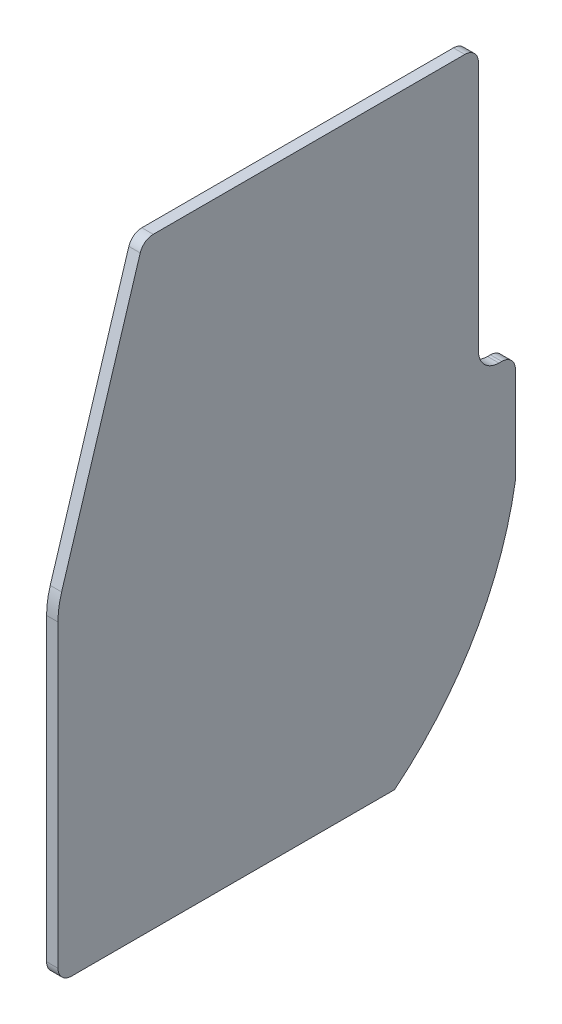
ISO-10303-21;
HEADER;
FILE_DESCRIPTION(('STEP AP214'),'2;1');
FILE_NAME('part.step','',(''),(''),'','','');
FILE_SCHEMA(('AUTOMOTIVE_DESIGN { 1 0 10303 214 1 1 1 1 }'));
ENDSEC;
DATA;
#1=APPLICATION_CONTEXT('core data for automotive mechanical design processes');
#2=APPLICATION_PROTOCOL_DEFINITION('international standard','automotive_design',2000,#1);
#3=PRODUCT_CONTEXT('',#1,'mechanical');
#4=PRODUCT('Part','Part','',(#3));
#5=PRODUCT_RELATED_PRODUCT_CATEGORY('part','',(#4));
#6=PRODUCT_DEFINITION_FORMATION('','',#4);
#7=PRODUCT_DEFINITION_CONTEXT('part definition',#1,'design');
#8=PRODUCT_DEFINITION('design','',#6,#7);
#9=PRODUCT_DEFINITION_SHAPE('','',#8);
#10=(LENGTH_UNIT() NAMED_UNIT(*) SI_UNIT(.MILLI.,.METRE.));
#11=(NAMED_UNIT(*) PLANE_ANGLE_UNIT() SI_UNIT($,.RADIAN.));
#12=(NAMED_UNIT(*) SI_UNIT($,.STERADIAN.) SOLID_ANGLE_UNIT());
#13=UNCERTAINTY_MEASURE_WITH_UNIT(LENGTH_MEASURE(1.E-05),#10,'distance_accuracy_value','');
#14=(GEOMETRIC_REPRESENTATION_CONTEXT(3) GLOBAL_UNCERTAINTY_ASSIGNED_CONTEXT((#13)) GLOBAL_UNIT_ASSIGNED_CONTEXT((#10,
#11,#12)) REPRESENTATION_CONTEXT('',''));
#15=CARTESIAN_POINT('',(0.,0.,0.));
#16=DIRECTION('',(0.,0.,1.));
#17=DIRECTION('',(1.,0.,0.));
#18=AXIS2_PLACEMENT_3D('',#15,#16,#17);
#19=CARTESIAN_POINT('',(20.,31.4994505346116,291.80217267077));
#20=DIRECTION('',(-1.,0.,0.));
#21=DIRECTION('',(0.,0.,1.));
#22=AXIS2_PLACEMENT_3D('',#19,#20,#21);
#23=CYLINDRICAL_SURFACE('',#22,144.);
#24=CARTESIAN_POINT('',(0.,31.4994505346116,291.80217267077));
#25=DIRECTION('',(1.,0.,0.));
#26=DIRECTION('',(0.,0.,-1.));
#27=AXIS2_PLACEMENT_3D('',#24,#25,#26);
#28=CIRCLE('',#27,144.);
#29=CARTESIAN_POINT('',(0.,74.0235535369056,429.380152972308));
#30=VERTEX_POINT('',#29);
#31=CARTESIAN_POINT('',(0.,31.499450534611,435.80217267077));
#32=VERTEX_POINT('',#31);
#33=EDGE_CURVE('E183',#30,#32,#28,.T.);
#34=ORIENTED_EDGE('',*,*,#33,.T.);
#35=DIRECTION('',(-1.,0.,0.));
#36=VECTOR('',#35,1.);
#37=CARTESIAN_POINT('',(20.,31.499450534611,435.80217267077));
#38=LINE('',#37,#36);
#39=CARTESIAN_POINT('',(20.,31.499450534611,435.80217267077));
#40=VERTEX_POINT('',#39);
#41=EDGE_CURVE('E242',#40,#32,#38,.T.);
#42=ORIENTED_EDGE('',*,*,#41,.F.);
#43=CARTESIAN_POINT('',(20.,31.4994505346116,291.80217267077));
#44=DIRECTION('',(1.,0.,0.));
#45=DIRECTION('',(0.,0.,-1.));
#46=AXIS2_PLACEMENT_3D('',#43,#44,#45);
#47=CIRCLE('',#46,144.);
#48=CARTESIAN_POINT('',(20.,74.0235535369056,429.380152972308));
#49=VERTEX_POINT('',#48);
#50=EDGE_CURVE('E211',#49,#40,#47,.T.);
#51=ORIENTED_EDGE('',*,*,#50,.F.);
#52=DIRECTION('',(-1.,0.,0.));
#53=VECTOR('',#52,1.);
#54=CARTESIAN_POINT('',(20.,74.0235535369056,429.380152972308));
#55=LINE('',#54,#53);
#56=EDGE_CURVE('E179',#49,#30,#55,.T.);
#57=ORIENTED_EDGE('',*,*,#56,.T.);
#58=EDGE_LOOP('',(#34,#42,#51,#57));
#59=FACE_BOUND('',#58,.T.);
#60=ADVANCED_FACE('F39',(#59),#23,.T.);
#61=CARTESIAN_POINT('',(20.,31.499450534611,435.80217267077));
#62=DIRECTION('',(0.,0.,-1.));
#63=DIRECTION('',(-1.,0.,0.));
#64=AXIS2_PLACEMENT_3D('',#61,#62,#63);
#65=PLANE('',#64);
#66=DIRECTION('',(0.,-1.,0.));
#67=VECTOR('',#66,1.);
#68=CARTESIAN_POINT('',(0.,31.499450534611,435.80217267077));
#69=LINE('',#68,#67);
#70=CARTESIAN_POINT('',(0.,-495.847444831591,435.80217267077));
#71=VERTEX_POINT('',#70);
#72=EDGE_CURVE('E186',#32,#71,#69,.T.);
#73=ORIENTED_EDGE('',*,*,#72,.T.);
#74=DIRECTION('',(-1.,0.,0.));
#75=VECTOR('',#74,1.);
#76=CARTESIAN_POINT('',(20.,-495.847444831591,435.80217267077));
#77=LINE('',#76,#75);
#78=CARTESIAN_POINT('',(20.,-495.847444831591,435.80217267077));
#79=VERTEX_POINT('',#78);
#80=EDGE_CURVE('E239',#79,#71,#77,.T.);
#81=ORIENTED_EDGE('',*,*,#80,.F.);
#82=DIRECTION('',(0.,-1.,0.));
#83=VECTOR('',#82,1.);
#84=CARTESIAN_POINT('',(20.,31.499450534611,435.80217267077));
#85=LINE('',#84,#83);
#86=EDGE_CURVE('E122',#40,#79,#85,.T.);
#87=ORIENTED_EDGE('',*,*,#86,.F.);
#88=ORIENTED_EDGE('',*,*,#41,.T.);
#89=EDGE_LOOP('',(#73,#81,#87,#88));
#90=FACE_BOUND('',#89,.T.);
#91=ADVANCED_FACE('F372',(#90),#65,.F.);
#92=CARTESIAN_POINT('',(20.,-495.847444831591,411.80217267077));
#93=DIRECTION('',(-1.,0.,0.));
#94=DIRECTION('',(0.,0.,1.));
#95=AXIS2_PLACEMENT_3D('',#92,#93,#94);
#96=CYLINDRICAL_SURFACE('',#95,24.);
#97=CARTESIAN_POINT('',(0.,-495.847444831591,411.80217267077));
#98=DIRECTION('',(1.,0.,0.));
#99=DIRECTION('',(0.,0.,-1.));
#100=AXIS2_PLACEMENT_3D('',#97,#98,#99);
#101=CIRCLE('',#100,24.);
#102=CARTESIAN_POINT('',(0.,-519.847444831591,411.80217267077));
#103=VERTEX_POINT('',#102);
#104=EDGE_CURVE('E189',#71,#103,#101,.T.);
#105=ORIENTED_EDGE('',*,*,#104,.T.);
#106=DIRECTION('',(-1.,0.,0.));
#107=VECTOR('',#106,1.);
#108=CARTESIAN_POINT('',(20.,-519.847444831591,411.80217267077));
#109=LINE('',#108,#107);
#110=CARTESIAN_POINT('',(20.,-519.847444831591,411.80217267077));
#111=VERTEX_POINT('',#110);
#112=EDGE_CURVE('E236',#111,#103,#109,.T.);
#113=ORIENTED_EDGE('',*,*,#112,.F.);
#114=CARTESIAN_POINT('',(20.,-495.847444831591,411.80217267077));
#115=DIRECTION('',(1.,0.,0.));
#116=DIRECTION('',(0.,0.,-1.));
#117=AXIS2_PLACEMENT_3D('',#114,#115,#116);
#118=CIRCLE('',#117,24.);
#119=EDGE_CURVE('E340',#79,#111,#118,.T.);
#120=ORIENTED_EDGE('',*,*,#119,.F.);
#121=ORIENTED_EDGE('',*,*,#80,.T.);
#122=EDGE_LOOP('',(#105,#113,#120,#121));
#123=FACE_BOUND('',#122,.T.);
#124=ADVANCED_FACE('F375',(#123),#96,.T.);
#125=CARTESIAN_POINT('',(20.,-519.847444831591,411.80217267077));
#126=DIRECTION('',(0.,1.,0.));
#127=DIRECTION('',(0.,0.,1.));
#128=AXIS2_PLACEMENT_3D('',#125,#126,#127);
#129=PLANE('',#128);
#130=DIRECTION('',(0.,0.,-1.));
#131=VECTOR('',#130,1.);
#132=CARTESIAN_POINT('',(0.,-519.847444831591,411.80217267077));
#133=LINE('',#132,#131);
#134=CARTESIAN_POINT('',(0.,-519.847444831591,-156.082330180603));
#135=VERTEX_POINT('',#134);
#136=EDGE_CURVE('E191',#103,#135,#133,.T.);
#137=ORIENTED_EDGE('',*,*,#136,.T.);
#138=DIRECTION('',(-1.,0.,0.));
#139=VECTOR('',#138,1.);
#140=CARTESIAN_POINT('',(20.,-519.847444831591,-156.082330180603));
#141=LINE('',#140,#139);
#142=CARTESIAN_POINT('',(20.,-519.847444831591,-156.082330180603));
#143=VERTEX_POINT('',#142);
#144=EDGE_CURVE('E233',#143,#135,#141,.T.);
#145=ORIENTED_EDGE('',*,*,#144,.F.);
#146=DIRECTION('',(0.,0.,-1.));
#147=VECTOR('',#146,1.);
#148=CARTESIAN_POINT('',(20.,-519.847444831591,411.80217267077));
#149=LINE('',#148,#147);
#150=EDGE_CURVE('E342',#111,#143,#149,.T.);
#151=ORIENTED_EDGE('',*,*,#150,.F.);
#152=ORIENTED_EDGE('',*,*,#112,.T.);
#153=EDGE_LOOP('',(#137,#145,#151,#152));
#154=FACE_BOUND('',#153,.T.);
#155=ADVANCED_FACE('F380',(#154),#129,.F.);
#156=CARTESIAN_POINT('',(20.,-57.8662366714706,217.293302804351));
#157=DIRECTION('',(-1.,0.,0.));
#158=DIRECTION('',(0.,0.,1.));
#159=AXIS2_PLACEMENT_3D('',#156,#157,#158);
#160=CYLINDRICAL_SURFACE('',#159,594.);
#161=CARTESIAN_POINT('',(0.,-57.8662366714706,217.293302804351));
#162=DIRECTION('',(1.,0.,0.));
#163=DIRECTION('',(0.,0.,-1.));
#164=AXIS2_PLACEMENT_3D('',#161,#162,#163);
#165=CIRCLE('',#164,594.);
#166=CARTESIAN_POINT('',(0.,-155.35298069123,-368.652372783775));
#167=VERTEX_POINT('',#166);
#168=EDGE_CURVE('E193',#135,#167,#165,.T.);
#169=ORIENTED_EDGE('',*,*,#168,.T.);
#170=DIRECTION('',(-1.,0.,0.));
#171=VECTOR('',#170,1.);
#172=CARTESIAN_POINT('',(20.,-155.35298069123,-368.652372783775));
#173=LINE('',#172,#171);
#174=CARTESIAN_POINT('',(20.,-155.35298069123,-368.652372783775));
#175=VERTEX_POINT('',#174);
#176=EDGE_CURVE('E230',#175,#167,#173,.T.);
#177=ORIENTED_EDGE('',*,*,#176,.F.);
#178=CARTESIAN_POINT('',(20.,-57.8662366714706,217.293302804351));
#179=DIRECTION('',(1.,0.,0.));
#180=DIRECTION('',(0.,0.,-1.));
#181=AXIS2_PLACEMENT_3D('',#178,#179,#180);
#182=CIRCLE('',#181,594.);
#183=EDGE_CURVE('E344',#143,#175,#182,.T.);
#184=ORIENTED_EDGE('',*,*,#183,.F.);
#185=ORIENTED_EDGE('',*,*,#144,.T.);
#186=EDGE_LOOP('',(#169,#177,#184,#185));
#187=FACE_BOUND('',#186,.T.);
#188=ADVANCED_FACE('F386',(#187),#160,.T.);
#189=CARTESIAN_POINT('',(20.,-155.35298069123,-368.652372783775));
#190=DIRECTION('',(0.,0.,1.));
#191=DIRECTION('',(1.,0.,0.));
#192=AXIS2_PLACEMENT_3D('',#189,#190,#191);
#193=PLANE('',#192);
#194=DIRECTION('',(0.,1.,0.));
#195=VECTOR('',#194,1.);
#196=CARTESIAN_POINT('',(0.,-155.35298069123,-368.652372783775));
#197=LINE('',#196,#195);
#198=CARTESIAN_POINT('',(0.,14.1525551684087,-368.652372783775));
#199=VERTEX_POINT('',#198);
#200=EDGE_CURVE('E195',#167,#199,#197,.T.);
#201=ORIENTED_EDGE('',*,*,#200,.T.);
#202=DIRECTION('',(-1.,0.,0.));
#203=VECTOR('',#202,1.);
#204=CARTESIAN_POINT('',(20.,14.1525551684087,-368.652372783775));
#205=LINE('',#204,#203);
#206=CARTESIAN_POINT('',(20.,14.1525551684087,-368.652372783775));
#207=VERTEX_POINT('',#206);
#208=EDGE_CURVE('E227',#207,#199,#205,.T.);
#209=ORIENTED_EDGE('',*,*,#208,.F.);
#210=DIRECTION('',(0.,1.,0.));
#211=VECTOR('',#210,1.);
#212=CARTESIAN_POINT('',(20.,-155.35298069123,-368.652372783775));
#213=LINE('',#212,#211);
#214=EDGE_CURVE('E346',#175,#207,#213,.T.);
#215=ORIENTED_EDGE('',*,*,#214,.F.);
#216=ORIENTED_EDGE('',*,*,#176,.T.);
#217=EDGE_LOOP('',(#201,#209,#215,#216));
#218=FACE_BOUND('',#217,.T.);
#219=ADVANCED_FACE('F390',(#218),#193,.F.);
#220=CARTESIAN_POINT('',(20.,14.152555168409,-344.652372783775));
#221=DIRECTION('',(-1.,0.,0.));
#222=DIRECTION('',(0.,0.,1.));
#223=AXIS2_PLACEMENT_3D('',#220,#221,#222);
#224=CYLINDRICAL_SURFACE('',#223,24.);
#225=CARTESIAN_POINT('',(0.,14.152555168409,-344.652372783775));
#226=DIRECTION('',(1.,0.,0.));
#227=DIRECTION('',(0.,0.,-1.));
#228=AXIS2_PLACEMENT_3D('',#225,#226,#227);
#229=CIRCLE('',#228,24.);
#230=CARTESIAN_POINT('',(0.,38.1525551684089,-344.652372783775));
#231=VERTEX_POINT('',#230);
#232=EDGE_CURVE('E197',#199,#231,#229,.T.);
#233=ORIENTED_EDGE('',*,*,#232,.T.);
#234=DIRECTION('',(-1.,0.,0.));
#235=VECTOR('',#234,1.);
#236=CARTESIAN_POINT('',(20.,38.1525551684089,-344.652372783775));
#237=LINE('',#236,#235);
#238=CARTESIAN_POINT('',(20.,38.1525551684089,-344.652372783775));
#239=VERTEX_POINT('',#238);
#240=EDGE_CURVE('E224',#239,#231,#237,.T.);
#241=ORIENTED_EDGE('',*,*,#240,.F.);
#242=CARTESIAN_POINT('',(20.,14.152555168409,-344.652372783775));
#243=DIRECTION('',(1.,0.,0.));
#244=DIRECTION('',(0.,0.,-1.));
#245=AXIS2_PLACEMENT_3D('',#242,#243,#244);
#246=CIRCLE('',#245,24.);
#247=EDGE_CURVE('E348',#207,#239,#246,.T.);
#248=ORIENTED_EDGE('',*,*,#247,.F.);
#249=ORIENTED_EDGE('',*,*,#208,.T.);
#250=EDGE_LOOP('',(#233,#241,#248,#249));
#251=FACE_BOUND('',#250,.T.);
#252=ADVANCED_FACE('F395',(#251),#224,.T.);
#253=CARTESIAN_POINT('',(20.,38.1525551684089,-344.652372783775));
#254=DIRECTION('',(0.,-1.,0.));
#255=DIRECTION('',(0.,0.,-1.));
#256=AXIS2_PLACEMENT_3D('',#253,#254,#255);
#257=PLANE('',#256);
#258=DIRECTION('',(0.,0.,1.));
#259=VECTOR('',#258,1.);
#260=CARTESIAN_POINT('',(0.,38.1525551684089,-344.652372783775));
#261=LINE('',#260,#259);
#262=CARTESIAN_POINT('',(0.,38.1525551684091,-339.652372783775));
#263=VERTEX_POINT('',#262);
#264=EDGE_CURVE('E199',#231,#263,#261,.T.);
#265=ORIENTED_EDGE('',*,*,#264,.T.);
#266=DIRECTION('',(-1.,0.,0.));
#267=VECTOR('',#266,1.);
#268=CARTESIAN_POINT('',(20.,38.1525551684091,-339.652372783775));
#269=LINE('',#268,#267);
#270=CARTESIAN_POINT('',(20.,38.1525551684091,-339.652372783775));
#271=VERTEX_POINT('',#270);
#272=EDGE_CURVE('E221',#271,#263,#269,.T.);
#273=ORIENTED_EDGE('',*,*,#272,.F.);
#274=DIRECTION('',(0.,0.,1.));
#275=VECTOR('',#274,1.);
#276=CARTESIAN_POINT('',(20.,38.1525551684089,-344.652372783775));
#277=LINE('',#276,#275);
#278=EDGE_CURVE('E350',#239,#271,#277,.T.);
#279=ORIENTED_EDGE('',*,*,#278,.F.);
#280=ORIENTED_EDGE('',*,*,#240,.T.);
#281=EDGE_LOOP('',(#265,#273,#279,#280));
#282=FACE_BOUND('',#281,.T.);
#283=ADVANCED_FACE('F399',(#282),#257,.F.);
#284=CARTESIAN_POINT('',(20.,74.152555168409,-339.652372783775));
#285=DIRECTION('',(-1.,0.,0.));
#286=DIRECTION('',(0.,0.,1.));
#287=AXIS2_PLACEMENT_3D('',#284,#285,#286);
#288=CYLINDRICAL_SURFACE('',#287,36.);
#289=CARTESIAN_POINT('',(0.,74.152555168409,-339.652372783775));
#290=DIRECTION('',(-1.,0.,0.));
#291=DIRECTION('',(0.,0.,-1.));
#292=AXIS2_PLACEMENT_3D('',#289,#290,#291);
#293=CIRCLE('',#292,36.);
#294=CARTESIAN_POINT('',(0.,74.1525551684092,-303.652372783775));
#295=VERTEX_POINT('',#294);
#296=EDGE_CURVE('E201',#263,#295,#293,.T.);
#297=ORIENTED_EDGE('',*,*,#296,.T.);
#298=DIRECTION('',(-1.,0.,0.));
#299=VECTOR('',#298,1.);
#300=CARTESIAN_POINT('',(20.,74.1525551684092,-303.652372783775));
#301=LINE('',#300,#299);
#302=CARTESIAN_POINT('',(20.,74.1525551684092,-303.652372783775));
#303=VERTEX_POINT('',#302);
#304=EDGE_CURVE('E218',#303,#295,#301,.T.);
#305=ORIENTED_EDGE('',*,*,#304,.F.);
#306=CARTESIAN_POINT('',(20.,74.152555168409,-339.652372783775));
#307=DIRECTION('',(-1.,0.,0.));
#308=DIRECTION('',(0.,0.,-1.));
#309=AXIS2_PLACEMENT_3D('',#306,#307,#308);
#310=CIRCLE('',#309,36.);
#311=EDGE_CURVE('E352',#271,#303,#310,.T.);
#312=ORIENTED_EDGE('',*,*,#311,.F.);
#313=ORIENTED_EDGE('',*,*,#272,.T.);
#314=EDGE_LOOP('',(#297,#305,#312,#313));
#315=FACE_BOUND('',#314,.T.);
#316=ADVANCED_FACE('F403',(#315),#288,.F.);
#317=CARTESIAN_POINT('',(20.,74.1525551684092,-303.652372783775));
#318=DIRECTION('',(0.,0.,1.));
#319=DIRECTION('',(0.,-1.,0.));
#320=AXIS2_PLACEMENT_3D('',#317,#318,#319);
#321=PLANE('',#320);
#322=DIRECTION('',(0.,1.,0.));
#323=VECTOR('',#322,1.);
#324=CARTESIAN_POINT('',(0.,74.1525551684092,-303.652372783775));
#325=LINE('',#324,#323);
#326=CARTESIAN_POINT('',(0.,514.152555168409,-303.652372783775));
#327=VERTEX_POINT('',#326);
#328=EDGE_CURVE('E203',#295,#327,#325,.T.);
#329=ORIENTED_EDGE('',*,*,#328,.T.);
#330=DIRECTION('',(-1.,0.,0.));
#331=VECTOR('',#330,1.);
#332=CARTESIAN_POINT('',(20.,514.152555168409,-303.652372783775));
#333=LINE('',#332,#331);
#334=CARTESIAN_POINT('',(20.,514.152555168409,-303.652372783775));
#335=VERTEX_POINT('',#334);
#336=EDGE_CURVE('E215',#335,#327,#333,.T.);
#337=ORIENTED_EDGE('',*,*,#336,.F.);
#338=DIRECTION('',(0.,1.,0.));
#339=VECTOR('',#338,1.);
#340=CARTESIAN_POINT('',(20.,74.1525551684092,-303.652372783775));
#341=LINE('',#340,#339);
#342=EDGE_CURVE('E354',#303,#335,#341,.T.);
#343=ORIENTED_EDGE('',*,*,#342,.F.);
#344=ORIENTED_EDGE('',*,*,#304,.T.);
#345=EDGE_LOOP('',(#329,#337,#343,#344));
#346=FACE_BOUND('',#345,.T.);
#347=ADVANCED_FACE('F360',(#346),#321,.F.);
#348=CARTESIAN_POINT('',(20.,514.152555168409,-279.652372783775));
#349=DIRECTION('',(-1.,0.,0.));
#350=DIRECTION('',(0.,0.,1.));
#351=AXIS2_PLACEMENT_3D('',#348,#349,#350);
#352=CYLINDRICAL_SURFACE('',#351,24.);
#353=CARTESIAN_POINT('',(0.,514.152555168409,-279.652372783775));
#354=DIRECTION('',(1.,0.,0.));
#355=DIRECTION('',(0.,0.,-1.));
#356=AXIS2_PLACEMENT_3D('',#353,#354,#355);
#357=CIRCLE('',#356,24.);
#358=CARTESIAN_POINT('',(0.,538.152555168409,-279.652372783775));
#359=VERTEX_POINT('',#358);
#360=EDGE_CURVE('E205',#327,#359,#357,.T.);
#361=ORIENTED_EDGE('',*,*,#360,.T.);
#362=DIRECTION('',(-1.,0.,0.));
#363=VECTOR('',#362,1.);
#364=CARTESIAN_POINT('',(20.,538.152555168409,-279.652372783775));
#365=LINE('',#364,#363);
#366=CARTESIAN_POINT('',(20.,538.152555168409,-279.652372783775));
#367=VERTEX_POINT('',#366);
#368=EDGE_CURVE('E174',#367,#359,#365,.T.);
#369=ORIENTED_EDGE('',*,*,#368,.F.);
#370=CARTESIAN_POINT('',(20.,514.152555168409,-279.652372783775));
#371=DIRECTION('',(1.,0.,0.));
#372=DIRECTION('',(0.,0.,-1.));
#373=AXIS2_PLACEMENT_3D('',#370,#371,#372);
#374=CIRCLE('',#373,24.);
#375=EDGE_CURVE('E162',#335,#367,#374,.T.);
#376=ORIENTED_EDGE('',*,*,#375,.F.);
#377=ORIENTED_EDGE('',*,*,#336,.T.);
#378=EDGE_LOOP('',(#361,#369,#376,#377));
#379=FACE_BOUND('',#378,.T.);
#380=ADVANCED_FACE('F364',(#379),#352,.T.);
#381=CARTESIAN_POINT('',(20.,538.152555168409,-279.652372783775));
#382=DIRECTION('',(0.,-1.,0.));
#383=DIRECTION('',(0.,0.,-1.));
#384=AXIS2_PLACEMENT_3D('',#381,#382,#383);
#385=PLANE('',#384);
#386=DIRECTION('',(0.,0.,1.));
#387=VECTOR('',#386,1.);
#388=CARTESIAN_POINT('',(0.,538.152555168409,-279.652372783775));
#389=LINE('',#388,#387);
#390=CARTESIAN_POINT('',(0.,538.152555168409,268.219980747954));
#391=VERTEX_POINT('',#390);
#392=EDGE_CURVE('E171',#359,#391,#389,.T.);
#393=ORIENTED_EDGE('',*,*,#392,.T.);
#394=DIRECTION('',(-1.,0.,0.));
#395=VECTOR('',#394,1.);
#396=CARTESIAN_POINT('',(20.,538.152555168409,268.219980747954));
#397=LINE('',#396,#395);
#398=CARTESIAN_POINT('',(20.,538.152555168409,268.219980747954));
#399=VERTEX_POINT('',#398);
#400=EDGE_CURVE('E168',#399,#391,#397,.T.);
#401=ORIENTED_EDGE('',*,*,#400,.F.);
#402=DIRECTION('',(0.,0.,1.));
#403=VECTOR('',#402,1.);
#404=CARTESIAN_POINT('',(20.,538.152555168409,-279.652372783775));
#405=LINE('',#404,#403);
#406=EDGE_CURVE('E155',#367,#399,#405,.T.);
#407=ORIENTED_EDGE('',*,*,#406,.F.);
#408=ORIENTED_EDGE('',*,*,#368,.T.);
#409=EDGE_LOOP('',(#393,#401,#407,#408));
#410=FACE_BOUND('',#409,.T.);
#411=ADVANCED_FACE('F169',(#410),#385,.F.);
#412=CARTESIAN_POINT('',(20.,514.152555168409,268.219980747954));
#413=DIRECTION('',(-1.,0.,0.));
#414=DIRECTION('',(0.,0.,1.));
#415=AXIS2_PLACEMENT_3D('',#412,#413,#414);
#416=CYLINDRICAL_SURFACE('',#415,24.0000000000002);
#417=CARTESIAN_POINT('',(0.,514.152555168409,268.219980747954));
#418=DIRECTION('',(1.,0.,0.));
#419=DIRECTION('',(0.,0.,-1.));
#420=AXIS2_PLACEMENT_3D('',#417,#418,#419);
#421=CIRCLE('',#420,24.0000000000002);
#422=CARTESIAN_POINT('',(0.,521.239905668791,291.149644131544));
#423=VERTEX_POINT('',#422);
#424=EDGE_CURVE('E208',#391,#423,#421,.T.);
#425=ORIENTED_EDGE('',*,*,#424,.T.);
#426=DIRECTION('',(-1.,0.,0.));
#427=VECTOR('',#426,1.);
#428=CARTESIAN_POINT('',(20.,521.239905668791,291.149644131544));
#429=LINE('',#428,#427);
#430=CARTESIAN_POINT('',(20.,521.239905668791,291.149644131544));
#431=VERTEX_POINT('',#430);
#432=EDGE_CURVE('E175',#431,#423,#429,.T.);
#433=ORIENTED_EDGE('',*,*,#432,.F.);
#434=CARTESIAN_POINT('',(20.,514.152555168409,268.219980747954));
#435=DIRECTION('',(1.,0.,0.));
#436=DIRECTION('',(0.,0.,-1.));
#437=AXIS2_PLACEMENT_3D('',#434,#435,#436);
#438=CIRCLE('',#437,24.0000000000002);
#439=EDGE_CURVE('E159',#399,#431,#438,.T.);
#440=ORIENTED_EDGE('',*,*,#439,.F.);
#441=ORIENTED_EDGE('',*,*,#400,.T.);
#442=EDGE_LOOP('',(#425,#433,#440,#441));
#443=FACE_BOUND('',#442,.T.);
#444=ADVANCED_FACE('F177',(#443),#416,.T.);
#445=CARTESIAN_POINT('',(20.,521.239905668791,291.149644131544));
#446=DIRECTION('',(0.,-0.29530627084926,-0.955402640982902));
#447=DIRECTION('',(0.,0.955402640982902,-0.29530627084926));
#448=AXIS2_PLACEMENT_3D('',#445,#446,#447);
#449=PLANE('',#448);
#450=DIRECTION('',(0.,-0.955402640982902,0.29530627084926));
#451=VECTOR('',#450,1.);
#452=CARTESIAN_POINT('',(0.,521.239905668791,291.149644131544));
#453=LINE('',#452,#451);
#454=EDGE_CURVE('E113',#423,#30,#453,.T.);
#455=ORIENTED_EDGE('',*,*,#454,.T.);
#456=ORIENTED_EDGE('',*,*,#56,.F.);
#457=DIRECTION('',(0.,-0.955402640982902,0.29530627084926));
#458=VECTOR('',#457,1.);
#459=CARTESIAN_POINT('',(20.,521.239905668791,291.149644131544));
#460=LINE('',#459,#458);
#461=EDGE_CURVE('E62',#431,#49,#460,.T.);
#462=ORIENTED_EDGE('',*,*,#461,.F.);
#463=ORIENTED_EDGE('',*,*,#432,.T.);
#464=EDGE_LOOP('',(#455,#456,#462,#463));
#465=FACE_BOUND('',#464,.T.);
#466=ADVANCED_FACE('F366',(#465),#449,.F.);
#467=CARTESIAN_POINT('',(20.,31.4994505346116,291.80217267077));
#468=DIRECTION('',(1.,0.,0.));
#469=DIRECTION('',(0.,0.,-1.));
#470=AXIS2_PLACEMENT_3D('',#467,#468,#469);
#471=PLANE('',#470);
#472=ORIENTED_EDGE('',*,*,#50,.T.);
#473=ORIENTED_EDGE('',*,*,#86,.T.);
#474=ORIENTED_EDGE('',*,*,#119,.T.);
#475=ORIENTED_EDGE('',*,*,#150,.T.);
#476=ORIENTED_EDGE('',*,*,#183,.T.);
#477=ORIENTED_EDGE('',*,*,#214,.T.);
#478=ORIENTED_EDGE('',*,*,#247,.T.);
#479=ORIENTED_EDGE('',*,*,#278,.T.);
#480=ORIENTED_EDGE('',*,*,#311,.T.);
#481=ORIENTED_EDGE('',*,*,#342,.T.);
#482=ORIENTED_EDGE('',*,*,#375,.T.);
#483=ORIENTED_EDGE('',*,*,#406,.T.);
#484=ORIENTED_EDGE('',*,*,#439,.T.);
#485=ORIENTED_EDGE('',*,*,#461,.T.);
#486=EDGE_LOOP('',(#472,#473,#474,#475,#476,#477,#478,#479,#480,#481,#482,#483,#484,#485));
#487=FACE_BOUND('',#486,.T.);
#488=ADVANCED_FACE('F157',(#487),#471,.T.);
#489=CARTESIAN_POINT('',(0.,31.4994505346116,291.80217267077));
#490=DIRECTION('',(1.,0.,0.));
#491=DIRECTION('',(0.,0.,-1.));
#492=AXIS2_PLACEMENT_3D('',#489,#490,#491);
#493=PLANE('',#492);
#494=DIRECTION('',(0.,-1.,0.));
#495=VECTOR('',#494,1.);
#496=CARTESIAN_POINT('',(0.,31.4994505346115,385.80217267077));
#497=LINE('',#496,#495);
#498=CARTESIAN_POINT('',(0.,31.4994505346112,385.80217267077));
#499=VERTEX_POINT('',#498);
#500=CARTESIAN_POINT('',(0.,-449.847444831591,385.80217267077));
#501=VERTEX_POINT('',#500);
#502=EDGE_CURVE('E46',#499,#501,#497,.T.);
#503=ORIENTED_EDGE('',*,*,#502,.T.);
#504=CARTESIAN_POINT('',(0.,-449.847444831591,365.80217267077));
#505=DIRECTION('',(1.,0.,0.));
#506=DIRECTION('',(0.,0.,-1.));
#507=AXIS2_PLACEMENT_3D('',#504,#505,#506);
#508=CIRCLE('',#507,20.);
#509=CARTESIAN_POINT('',(0.,-469.847444831591,365.80217267077));
#510=VERTEX_POINT('',#509);
#511=EDGE_CURVE('E11',#501,#510,#508,.T.);
#512=ORIENTED_EDGE('',*,*,#511,.T.);
#513=DIRECTION('',(0.,0.,-1.));
#514=VECTOR('',#513,1.);
#515=CARTESIAN_POINT('',(0.,-469.847444831591,291.80217267077));
#516=LINE('',#515,#514);
#517=CARTESIAN_POINT('',(0.,-469.847444831591,-137.963624113235));
#518=VERTEX_POINT('',#517);
#519=EDGE_CURVE('E244',#510,#518,#516,.T.);
#520=ORIENTED_EDGE('',*,*,#519,.T.);
#521=CARTESIAN_POINT('',(0.,-57.8662366714706,217.293302804351));
#522=DIRECTION('',(1.,0.,0.));
#523=DIRECTION('',(0.,0.,-1.));
#524=AXIS2_PLACEMENT_3D('',#521,#522,#523);
#525=CIRCLE('',#524,544.);
#526=CARTESIAN_POINT('',(0.,-151.130553633462,-318.652372783775));
#527=VERTEX_POINT('',#526);
#528=EDGE_CURVE('E247',#518,#527,#525,.T.);
#529=ORIENTED_EDGE('',*,*,#528,.T.);
#530=DIRECTION('',(0.,1.,0.));
#531=VECTOR('',#530,1.);
#532=CARTESIAN_POINT('',(0.,31.4994505346118,-318.652372783775));
#533=LINE('',#532,#531);
#534=CARTESIAN_POINT('',(0.,-23.5971251379737,-318.652372783775));
#535=VERTEX_POINT('',#534);
#536=EDGE_CURVE('E250',#527,#535,#533,.T.);
#537=ORIENTED_EDGE('',*,*,#536,.T.);
#538=CARTESIAN_POINT('',(0.,-23.5971251379737,-298.652372783775));
#539=DIRECTION('',(1.,0.,0.));
#540=DIRECTION('',(0.,0.,-1.));
#541=AXIS2_PLACEMENT_3D('',#538,#539,#540);
#542=CIRCLE('',#541,20.);
#543=CARTESIAN_POINT('',(0.,-5.15378923110901,-306.388221840379));
#544=VERTEX_POINT('',#543);
#545=EDGE_CURVE('E253',#535,#544,#542,.T.);
#546=ORIENTED_EDGE('',*,*,#545,.T.);
#547=CARTESIAN_POINT('',(0.,74.152555168409,-339.652372783775));
#548=DIRECTION('',(1.,0.,0.));
#549=DIRECTION('',(0.,0.,-1.));
#550=AXIS2_PLACEMENT_3D('',#547,#548,#549);
#551=CIRCLE('',#550,86.);
#552=CARTESIAN_POINT('',(0.,74.1525551684095,-253.652372783775));
#553=VERTEX_POINT('',#552);
#554=EDGE_CURVE('E256',#544,#553,#551,.F.);
#555=ORIENTED_EDGE('',*,*,#554,.T.);
#556=DIRECTION('',(0.,1.,0.));
#557=VECTOR('',#556,1.);
#558=CARTESIAN_POINT('',(0.,31.499450534611,-253.652372783775));
#559=LINE('',#558,#557);
#560=CARTESIAN_POINT('',(0.,468.152555168409,-253.652372783775));
#561=VERTEX_POINT('',#560);
#562=EDGE_CURVE('E259',#553,#561,#559,.T.);
#563=ORIENTED_EDGE('',*,*,#562,.T.);
#564=CARTESIAN_POINT('',(0.,468.152555168409,-233.652372783775));
#565=DIRECTION('',(1.,0.,0.));
#566=DIRECTION('',(0.,0.,-1.));
#567=AXIS2_PLACEMENT_3D('',#564,#565,#566);
#568=CIRCLE('',#567,20.);
#569=CARTESIAN_POINT('',(0.,488.152555168409,-233.652372783775));
#570=VERTEX_POINT('',#569);
#571=EDGE_CURVE('E262',#561,#570,#568,.T.);
#572=ORIENTED_EDGE('',*,*,#571,.T.);
#573=DIRECTION('',(0.,0.,1.));
#574=VECTOR('',#573,1.);
#575=CARTESIAN_POINT('',(0.,488.152555168409,291.80217267077));
#576=LINE('',#575,#574);
#577=CARTESIAN_POINT('',(0.,488.152555168409,234.290922829938));
#578=VERTEX_POINT('',#577);
#579=EDGE_CURVE('E265',#570,#578,#576,.T.);
#580=ORIENTED_EDGE('',*,*,#579,.T.);
#581=CARTESIAN_POINT('',(0.,468.152555168409,234.290922829938));
#582=DIRECTION('',(1.,0.,0.));
#583=DIRECTION('',(0.,0.,-1.));
#584=AXIS2_PLACEMENT_3D('',#581,#582,#583);
#585=CIRCLE('',#584,20.);
#586=CARTESIAN_POINT('',(0.,474.058680585394,253.398975649596));
#587=VERTEX_POINT('',#586);
#588=EDGE_CURVE('E268',#578,#587,#585,.T.);
#589=ORIENTED_EDGE('',*,*,#588,.T.);
#590=DIRECTION('',(0.,-0.955402640982902,0.29530627084926));
#591=VECTOR('',#590,1.);
#592=CARTESIAN_POINT('',(0.,59.258239994442,381.610020923163));
#593=LINE('',#592,#591);
#594=CARTESIAN_POINT('',(0.,59.2582399944424,381.610020923163));
#595=VERTEX_POINT('',#594);
#596=EDGE_CURVE('E271',#587,#595,#593,.T.);
#597=ORIENTED_EDGE('',*,*,#596,.T.);
#598=CARTESIAN_POINT('',(0.,31.4994505346116,291.80217267077));
#599=DIRECTION('',(1.,0.,0.));
#600=DIRECTION('',(0.,0.,-1.));
#601=AXIS2_PLACEMENT_3D('',#598,#599,#600);
#602=CIRCLE('',#601,94.0000000000001);
#603=EDGE_CURVE('E274',#595,#499,#602,.T.);
#604=ORIENTED_EDGE('',*,*,#603,.T.);
#605=EDGE_LOOP('',(#503,#512,#520,#529,#537,#546,#555,#563,#572,#580,#589,#597,#604));
#606=FACE_BOUND('',#605,.T.);
#607=ORIENTED_EDGE('',*,*,#33,.F.);
#608=ORIENTED_EDGE('',*,*,#454,.F.);
#609=ORIENTED_EDGE('',*,*,#424,.F.);
#610=ORIENTED_EDGE('',*,*,#392,.F.);
#611=ORIENTED_EDGE('',*,*,#360,.F.);
#612=ORIENTED_EDGE('',*,*,#328,.F.);
#613=ORIENTED_EDGE('',*,*,#296,.F.);
#614=ORIENTED_EDGE('',*,*,#264,.F.);
#615=ORIENTED_EDGE('',*,*,#232,.F.);
#616=ORIENTED_EDGE('',*,*,#200,.F.);
#617=ORIENTED_EDGE('',*,*,#168,.F.);
#618=ORIENTED_EDGE('',*,*,#136,.F.);
#619=ORIENTED_EDGE('',*,*,#104,.F.);
#620=ORIENTED_EDGE('',*,*,#72,.F.);
#621=EDGE_LOOP('',(#607,#608,#609,#610,#611,#612,#613,#614,#615,#616,#617,#618,#619,#620));
#622=FACE_BOUND('',#621,.T.);
#623=ADVANCED_FACE('F279',(#606,#622),#493,.F.);
#624=CARTESIAN_POINT('',(-20.,-449.847444831591,365.80217267077));
#625=DIRECTION('',(1.,0.,0.));
#626=DIRECTION('',(0.,0.,-1.));
#627=AXIS2_PLACEMENT_3D('',#624,#625,#626);
#628=CYLINDRICAL_SURFACE('',#627,20.);
#629=ORIENTED_EDGE('',*,*,#511,.F.);
#630=DIRECTION('',(1.,0.,0.));
#631=VECTOR('',#630,1.);
#632=CARTESIAN_POINT('',(-20.,-449.847444831591,385.80217267077));
#633=LINE('',#632,#631);
#634=CARTESIAN_POINT('',(-20.,-449.847444831591,385.80217267077));
#635=VERTEX_POINT('',#634);
#636=EDGE_CURVE('E187',#635,#501,#633,.T.);
#637=ORIENTED_EDGE('',*,*,#636,.F.);
#638=CARTESIAN_POINT('',(-20.,-449.847444831591,365.80217267077));
#639=DIRECTION('',(1.,0.,0.));
#640=DIRECTION('',(0.,0.,-1.));
#641=AXIS2_PLACEMENT_3D('',#638,#639,#640);
#642=CIRCLE('',#641,20.);
#643=CARTESIAN_POINT('',(-20.,-469.847444831591,365.80217267077));
#644=VERTEX_POINT('',#643);
#645=EDGE_CURVE('E638',#635,#644,#642,.T.);
#646=ORIENTED_EDGE('',*,*,#645,.T.);
#647=DIRECTION('',(1.,0.,0.));
#648=VECTOR('',#647,1.);
#649=CARTESIAN_POINT('',(-20.,-469.847444831591,365.80217267077));
#650=LINE('',#649,#648);
#651=EDGE_CURVE('E334',#644,#510,#650,.T.);
#652=ORIENTED_EDGE('',*,*,#651,.T.);
#653=EDGE_LOOP('',(#629,#637,#646,#652));
#654=FACE_BOUND('',#653,.T.);
#655=ADVANCED_FACE('F497',(#654),#628,.T.);
#656=CARTESIAN_POINT('',(-20.,31.4994505346112,385.80217267077));
#657=DIRECTION('',(0.,0.,1.));
#658=DIRECTION('',(0.,-1.,0.));
#659=AXIS2_PLACEMENT_3D('',#656,#657,#658);
#660=PLANE('',#659);
#661=ORIENTED_EDGE('',*,*,#502,.F.);
#662=DIRECTION('',(1.,0.,0.));
#663=VECTOR('',#662,1.);
#664=CARTESIAN_POINT('',(-20.,31.4994505346112,385.80217267077));
#665=LINE('',#664,#663);
#666=CARTESIAN_POINT('',(-20.,31.4994505346112,385.80217267077));
#667=VERTEX_POINT('',#666);
#668=EDGE_CURVE('E292',#667,#499,#665,.T.);
#669=ORIENTED_EDGE('',*,*,#668,.F.);
#670=DIRECTION('',(0.,-1.,0.));
#671=VECTOR('',#670,1.);
#672=CARTESIAN_POINT('',(-20.,31.4994505346112,385.80217267077));
#673=LINE('',#672,#671);
#674=EDGE_CURVE('E337',#667,#635,#673,.T.);
#675=ORIENTED_EDGE('',*,*,#674,.T.);
#676=ORIENTED_EDGE('',*,*,#636,.T.);
#677=EDGE_LOOP('',(#661,#669,#675,#676));
#678=FACE_BOUND('',#677,.T.);
#679=ADVANCED_FACE('F289',(#678),#660,.T.);
#680=CARTESIAN_POINT('',(-20.,31.4994505346116,291.80217267077));
#681=DIRECTION('',(1.,0.,0.));
#682=DIRECTION('',(0.,0.,-1.));
#683=AXIS2_PLACEMENT_3D('',#680,#681,#682);
#684=CYLINDRICAL_SURFACE('',#683,94.0000000000001);
#685=ORIENTED_EDGE('',*,*,#603,.F.);
#686=DIRECTION('',(1.,0.,0.));
#687=VECTOR('',#686,1.);
#688=CARTESIAN_POINT('',(-20.,59.2582399944424,381.610020923163));
#689=LINE('',#688,#687);
#690=CARTESIAN_POINT('',(-20.,59.2582399944424,381.610020923163));
#691=VERTEX_POINT('',#690);
#692=EDGE_CURVE('E303',#691,#595,#689,.T.);
#693=ORIENTED_EDGE('',*,*,#692,.F.);
#694=CARTESIAN_POINT('',(-20.,31.4994505346116,291.80217267077));
#695=DIRECTION('',(1.,0.,0.));
#696=DIRECTION('',(0.,0.,-1.));
#697=AXIS2_PLACEMENT_3D('',#694,#695,#696);
#698=CIRCLE('',#697,94.0000000000001);
#699=EDGE_CURVE('E301',#691,#667,#698,.T.);
#700=ORIENTED_EDGE('',*,*,#699,.T.);
#701=ORIENTED_EDGE('',*,*,#668,.T.);
#702=EDGE_LOOP('',(#685,#693,#700,#701));
#703=FACE_BOUND('',#702,.T.);
#704=ADVANCED_FACE('F297',(#703),#684,.T.);
#705=CARTESIAN_POINT('',(-20.,474.058680585394,253.398975649596));
#706=DIRECTION('',(0.,0.29530627084926,0.955402640982902));
#707=DIRECTION('',(0.,-0.955402640982902,0.29530627084926));
#708=AXIS2_PLACEMENT_3D('',#705,#706,#707);
#709=PLANE('',#708);
#710=ORIENTED_EDGE('',*,*,#596,.F.);
#711=DIRECTION('',(1.,0.,0.));
#712=VECTOR('',#711,1.);
#713=CARTESIAN_POINT('',(-20.,474.058680585394,253.398975649596));
#714=LINE('',#713,#712);
#715=CARTESIAN_POINT('',(-20.,474.058680585394,253.398975649596));
#716=VERTEX_POINT('',#715);
#717=EDGE_CURVE('E306',#716,#587,#714,.T.);
#718=ORIENTED_EDGE('',*,*,#717,.F.);
#719=DIRECTION('',(0.,-0.955402640982902,0.29530627084926));
#720=VECTOR('',#719,1.);
#721=CARTESIAN_POINT('',(-20.,474.058680585394,253.398975649596));
#722=LINE('',#721,#720);
#723=EDGE_CURVE('E644',#716,#691,#722,.T.);
#724=ORIENTED_EDGE('',*,*,#723,.T.);
#725=ORIENTED_EDGE('',*,*,#692,.T.);
#726=EDGE_LOOP('',(#710,#718,#724,#725));
#727=FACE_BOUND('',#726,.T.);
#728=ADVANCED_FACE('F523',(#727),#709,.T.);
#729=CARTESIAN_POINT('',(-20.,468.152555168409,234.290922829938));
#730=DIRECTION('',(1.,0.,0.));
#731=DIRECTION('',(0.,0.,-1.));
#732=AXIS2_PLACEMENT_3D('',#729,#730,#731);
#733=CYLINDRICAL_SURFACE('',#732,20.);
#734=ORIENTED_EDGE('',*,*,#588,.F.);
#735=DIRECTION('',(1.,0.,0.));
#736=VECTOR('',#735,1.);
#737=CARTESIAN_POINT('',(-20.,488.152555168409,234.290922829938));
#738=LINE('',#737,#736);
#739=CARTESIAN_POINT('',(-20.,488.152555168409,234.290922829938));
#740=VERTEX_POINT('',#739);
#741=EDGE_CURVE('E312',#740,#578,#738,.T.);
#742=ORIENTED_EDGE('',*,*,#741,.F.);
#743=CARTESIAN_POINT('',(-20.,468.152555168409,234.290922829938));
#744=DIRECTION('',(1.,0.,0.));
#745=DIRECTION('',(0.,0.,-1.));
#746=AXIS2_PLACEMENT_3D('',#743,#744,#745);
#747=CIRCLE('',#746,20.);
#748=EDGE_CURVE('E649',#740,#716,#747,.T.);
#749=ORIENTED_EDGE('',*,*,#748,.T.);
#750=ORIENTED_EDGE('',*,*,#717,.T.);
#751=EDGE_LOOP('',(#734,#742,#749,#750));
#752=FACE_BOUND('',#751,.T.);
#753=ADVANCED_FACE('F532',(#752),#733,.T.);
#754=CARTESIAN_POINT('',(-20.,488.152555168409,-233.652372783775));
#755=DIRECTION('',(0.,1.,0.));
#756=DIRECTION('',(0.,0.,1.));
#757=AXIS2_PLACEMENT_3D('',#754,#755,#756);
#758=PLANE('',#757);
#759=ORIENTED_EDGE('',*,*,#579,.F.);
#760=DIRECTION('',(1.,0.,0.));
#761=VECTOR('',#760,1.);
#762=CARTESIAN_POINT('',(-20.,488.152555168409,-233.652372783775));
#763=LINE('',#762,#761);
#764=CARTESIAN_POINT('',(-20.,488.152555168409,-233.652372783775));
#765=VERTEX_POINT('',#764);
#766=EDGE_CURVE('E315',#765,#570,#763,.T.);
#767=ORIENTED_EDGE('',*,*,#766,.F.);
#768=DIRECTION('',(0.,0.,1.));
#769=VECTOR('',#768,1.);
#770=CARTESIAN_POINT('',(-20.,488.152555168409,-233.652372783775));
#771=LINE('',#770,#769);
#772=EDGE_CURVE('E652',#765,#740,#771,.T.);
#773=ORIENTED_EDGE('',*,*,#772,.T.);
#774=ORIENTED_EDGE('',*,*,#741,.T.);
#775=EDGE_LOOP('',(#759,#767,#773,#774));
#776=FACE_BOUND('',#775,.T.);
#777=ADVANCED_FACE('F542',(#776),#758,.T.);
#778=CARTESIAN_POINT('',(-20.,468.152555168409,-233.652372783775));
#779=DIRECTION('',(1.,0.,0.));
#780=DIRECTION('',(0.,0.,-1.));
#781=AXIS2_PLACEMENT_3D('',#778,#779,#780);
#782=CYLINDRICAL_SURFACE('',#781,20.);
#783=ORIENTED_EDGE('',*,*,#571,.F.);
#784=DIRECTION('',(1.,0.,0.));
#785=VECTOR('',#784,1.);
#786=CARTESIAN_POINT('',(-20.,468.152555168409,-253.652372783775));
#787=LINE('',#786,#785);
#788=CARTESIAN_POINT('',(-20.,468.152555168409,-253.652372783775));
#789=VERTEX_POINT('',#788);
#790=EDGE_CURVE('E318',#789,#561,#787,.T.);
#791=ORIENTED_EDGE('',*,*,#790,.F.);
#792=CARTESIAN_POINT('',(-20.,468.152555168409,-233.652372783775));
#793=DIRECTION('',(1.,0.,0.));
#794=DIRECTION('',(0.,0.,-1.));
#795=AXIS2_PLACEMENT_3D('',#792,#793,#794);
#796=CIRCLE('',#795,20.);
#797=EDGE_CURVE('E655',#789,#765,#796,.T.);
#798=ORIENTED_EDGE('',*,*,#797,.T.);
#799=ORIENTED_EDGE('',*,*,#766,.T.);
#800=EDGE_LOOP('',(#783,#791,#798,#799));
#801=FACE_BOUND('',#800,.T.);
#802=ADVANCED_FACE('F552',(#801),#782,.T.);
#803=CARTESIAN_POINT('',(-20.,74.1525551684095,-253.652372783775));
#804=DIRECTION('',(0.,0.,-1.));
#805=DIRECTION('',(0.,1.,0.));
#806=AXIS2_PLACEMENT_3D('',#803,#804,#805);
#807=PLANE('',#806);
#808=ORIENTED_EDGE('',*,*,#562,.F.);
#809=DIRECTION('',(1.,0.,0.));
#810=VECTOR('',#809,1.);
#811=CARTESIAN_POINT('',(-20.,74.1525551684095,-253.652372783775));
#812=LINE('',#811,#810);
#813=CARTESIAN_POINT('',(-20.,74.1525551684095,-253.652372783775));
#814=VERTEX_POINT('',#813);
#815=EDGE_CURVE('E321',#814,#553,#812,.T.);
#816=ORIENTED_EDGE('',*,*,#815,.F.);
#817=DIRECTION('',(0.,1.,0.));
#818=VECTOR('',#817,1.);
#819=CARTESIAN_POINT('',(-20.,74.1525551684095,-253.652372783775));
#820=LINE('',#819,#818);
#821=EDGE_CURVE('E658',#814,#789,#820,.T.);
#822=ORIENTED_EDGE('',*,*,#821,.T.);
#823=ORIENTED_EDGE('',*,*,#790,.T.);
#824=EDGE_LOOP('',(#808,#816,#822,#823));
#825=FACE_BOUND('',#824,.T.);
#826=ADVANCED_FACE('F562',(#825),#807,.T.);
#827=CARTESIAN_POINT('',(-20.,74.152555168409,-339.652372783775));
#828=DIRECTION('',(1.,0.,0.));
#829=DIRECTION('',(0.,0.,-1.));
#830=AXIS2_PLACEMENT_3D('',#827,#828,#829);
#831=CYLINDRICAL_SURFACE('',#830,86.);
#832=ORIENTED_EDGE('',*,*,#554,.F.);
#833=DIRECTION('',(1.,0.,0.));
#834=VECTOR('',#833,1.);
#835=CARTESIAN_POINT('',(-20.,-5.15378923110901,-306.388221840379));
#836=LINE('',#835,#834);
#837=CARTESIAN_POINT('',(-20.,-5.15378923110901,-306.388221840379));
#838=VERTEX_POINT('',#837);
#839=EDGE_CURVE('E324',#838,#544,#836,.T.);
#840=ORIENTED_EDGE('',*,*,#839,.F.);
#841=CARTESIAN_POINT('',(-20.,74.152555168409,-339.652372783775));
#842=DIRECTION('',(-1.,0.,0.));
#843=DIRECTION('',(0.,0.,-1.));
#844=AXIS2_PLACEMENT_3D('',#841,#842,#843);
#845=CIRCLE('',#844,86.);
#846=EDGE_CURVE('E661',#838,#814,#845,.T.);
#847=ORIENTED_EDGE('',*,*,#846,.T.);
#848=ORIENTED_EDGE('',*,*,#815,.T.);
#849=EDGE_LOOP('',(#832,#840,#847,#848));
#850=FACE_BOUND('',#849,.T.);
#851=ADVANCED_FACE('F572',(#850),#831,.F.);
#852=CARTESIAN_POINT('',(-20.,-23.5971251379737,-298.652372783775));
#853=DIRECTION('',(1.,0.,0.));
#854=DIRECTION('',(0.,0.,-1.));
#855=AXIS2_PLACEMENT_3D('',#852,#853,#854);
#856=CYLINDRICAL_SURFACE('',#855,20.);
#857=ORIENTED_EDGE('',*,*,#545,.F.);
#858=DIRECTION('',(1.,0.,0.));
#859=VECTOR('',#858,1.);
#860=CARTESIAN_POINT('',(-20.,-23.5971251379737,-318.652372783775));
#861=LINE('',#860,#859);
#862=CARTESIAN_POINT('',(-20.,-23.5971251379737,-318.652372783775));
#863=VERTEX_POINT('',#862);
#864=EDGE_CURVE('E327',#863,#535,#861,.T.);
#865=ORIENTED_EDGE('',*,*,#864,.F.);
#866=CARTESIAN_POINT('',(-20.,-23.5971251379737,-298.652372783775));
#867=DIRECTION('',(1.,0.,0.));
#868=DIRECTION('',(0.,0.,-1.));
#869=AXIS2_PLACEMENT_3D('',#866,#867,#868);
#870=CIRCLE('',#869,20.);
#871=EDGE_CURVE('E664',#863,#838,#870,.T.);
#872=ORIENTED_EDGE('',*,*,#871,.T.);
#873=ORIENTED_EDGE('',*,*,#839,.T.);
#874=EDGE_LOOP('',(#857,#865,#872,#873));
#875=FACE_BOUND('',#874,.T.);
#876=ADVANCED_FACE('F582',(#875),#856,.T.);
#877=CARTESIAN_POINT('',(-20.,-151.130553633462,-318.652372783775));
#878=DIRECTION('',(0.,0.,-1.));
#879=DIRECTION('',(0.,1.,0.));
#880=AXIS2_PLACEMENT_3D('',#877,#878,#879);
#881=PLANE('',#880);
#882=ORIENTED_EDGE('',*,*,#536,.F.);
#883=DIRECTION('',(1.,0.,0.));
#884=VECTOR('',#883,1.);
#885=CARTESIAN_POINT('',(-20.,-151.130553633462,-318.652372783775));
#886=LINE('',#885,#884);
#887=CARTESIAN_POINT('',(-20.,-151.130553633462,-318.652372783775));
#888=VERTEX_POINT('',#887);
#889=EDGE_CURVE('E330',#888,#527,#886,.T.);
#890=ORIENTED_EDGE('',*,*,#889,.F.);
#891=DIRECTION('',(0.,1.,0.));
#892=VECTOR('',#891,1.);
#893=CARTESIAN_POINT('',(-20.,-151.130553633462,-318.652372783775));
#894=LINE('',#893,#892);
#895=EDGE_CURVE('E667',#888,#863,#894,.T.);
#896=ORIENTED_EDGE('',*,*,#895,.T.);
#897=ORIENTED_EDGE('',*,*,#864,.T.);
#898=EDGE_LOOP('',(#882,#890,#896,#897));
#899=FACE_BOUND('',#898,.T.);
#900=ADVANCED_FACE('F592',(#899),#881,.T.);
#901=CARTESIAN_POINT('',(-20.,-57.8662366714706,217.293302804351));
#902=DIRECTION('',(1.,0.,0.));
#903=DIRECTION('',(0.,0.,-1.));
#904=AXIS2_PLACEMENT_3D('',#901,#902,#903);
#905=CYLINDRICAL_SURFACE('',#904,544.);
#906=ORIENTED_EDGE('',*,*,#528,.F.);
#907=DIRECTION('',(1.,0.,0.));
#908=VECTOR('',#907,1.);
#909=CARTESIAN_POINT('',(-20.,-469.847444831592,-137.963624113235));
#910=LINE('',#909,#908);
#911=CARTESIAN_POINT('',(-20.,-469.847444831592,-137.963624113235));
#912=VERTEX_POINT('',#911);
#913=EDGE_CURVE('E53',#912,#518,#910,.T.);
#914=ORIENTED_EDGE('',*,*,#913,.F.);
#915=CARTESIAN_POINT('',(-20.,-57.8662366714706,217.293302804351));
#916=DIRECTION('',(1.,0.,0.));
#917=DIRECTION('',(0.,0.,-1.));
#918=AXIS2_PLACEMENT_3D('',#915,#916,#917);
#919=CIRCLE('',#918,544.);
#920=EDGE_CURVE('E670',#912,#888,#919,.T.);
#921=ORIENTED_EDGE('',*,*,#920,.T.);
#922=ORIENTED_EDGE('',*,*,#889,.T.);
#923=EDGE_LOOP('',(#906,#914,#921,#922));
#924=FACE_BOUND('',#923,.T.);
#925=ADVANCED_FACE('F602',(#924),#905,.T.);
#926=CARTESIAN_POINT('',(-20.,-469.847444831591,365.80217267077));
#927=DIRECTION('',(0.,-1.,0.));
#928=DIRECTION('',(0.,0.,-1.));
#929=AXIS2_PLACEMENT_3D('',#926,#927,#928);
#930=PLANE('',#929);
#931=ORIENTED_EDGE('',*,*,#519,.F.);
#932=ORIENTED_EDGE('',*,*,#651,.F.);
#933=DIRECTION('',(0.,0.,-1.));
#934=VECTOR('',#933,1.);
#935=CARTESIAN_POINT('',(-20.,-469.847444831591,365.80217267077));
#936=LINE('',#935,#934);
#937=EDGE_CURVE('E641',#644,#912,#936,.T.);
#938=ORIENTED_EDGE('',*,*,#937,.T.);
#939=ORIENTED_EDGE('',*,*,#913,.T.);
#940=EDGE_LOOP('',(#931,#932,#938,#939));
#941=FACE_BOUND('',#940,.T.);
#942=ADVANCED_FACE('F612',(#941),#930,.T.);
#943=CARTESIAN_POINT('',(-20.,-449.847444831591,365.80217267077));
#944=DIRECTION('',(1.,0.,0.));
#945=DIRECTION('',(0.,0.,-1.));
#946=AXIS2_PLACEMENT_3D('',#943,#944,#945);
#947=PLANE('',#946);
#948=ORIENTED_EDGE('',*,*,#645,.F.);
#949=ORIENTED_EDGE('',*,*,#674,.F.);
#950=ORIENTED_EDGE('',*,*,#699,.F.);
#951=ORIENTED_EDGE('',*,*,#723,.F.);
#952=ORIENTED_EDGE('',*,*,#748,.F.);
#953=ORIENTED_EDGE('',*,*,#772,.F.);
#954=ORIENTED_EDGE('',*,*,#797,.F.);
#955=ORIENTED_EDGE('',*,*,#821,.F.);
#956=ORIENTED_EDGE('',*,*,#846,.F.);
#957=ORIENTED_EDGE('',*,*,#871,.F.);
#958=ORIENTED_EDGE('',*,*,#895,.F.);
#959=ORIENTED_EDGE('',*,*,#920,.F.);
#960=ORIENTED_EDGE('',*,*,#937,.F.);
#961=EDGE_LOOP('',(#948,#949,#950,#951,#952,#953,#954,#955,#956,#957,#958,#959,#960));
#962=FACE_BOUND('',#961,.T.);
#963=ADVANCED_FACE('F622',(#962),#947,.F.);
#964=CLOSED_SHELL('',(#60,#91,#124,#155,#188,#219,#252,#283,#316,#347,#380,#411,#444,#466,#488,
#623,#655,#679,#704,#728,#753,#777,#802,#826,#851,#876,#900,#925,#942,#963));
#965=MANIFOLD_SOLID_BREP('B2',#964);
#966=ADVANCED_BREP_SHAPE_REPRESENTATION('',(#18,#965),#14);
#967=SHAPE_DEFINITION_REPRESENTATION(#9,#966);
ENDSEC;
END-ISO-10303-21;
